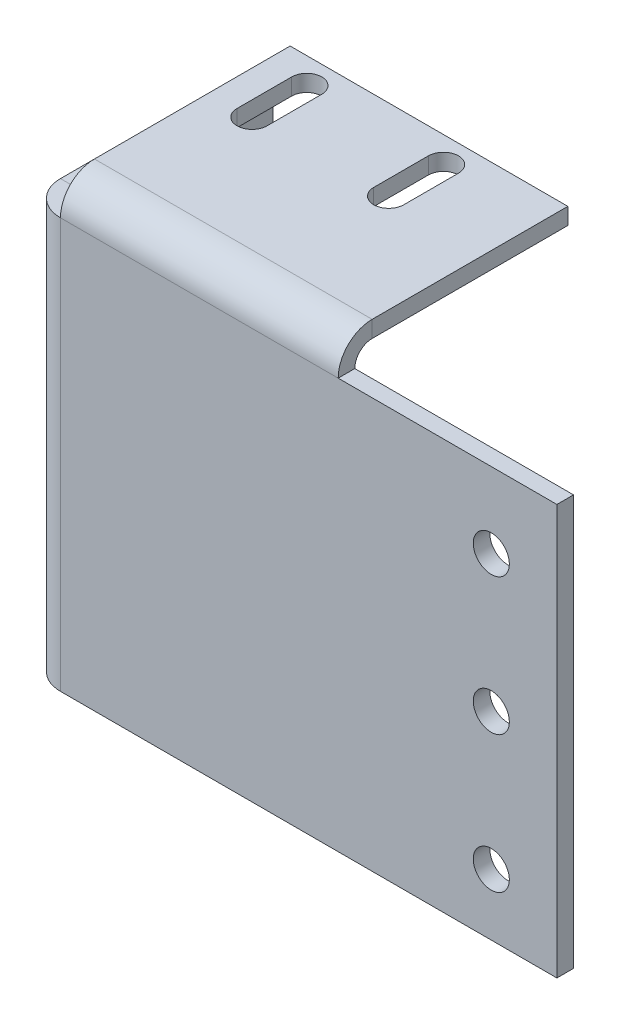
ISO-10303-21;
HEADER;
FILE_DESCRIPTION(('STEP AP214'),'2;1');
FILE_NAME('part.step','',(''),(''),'','','');
FILE_SCHEMA(('AUTOMOTIVE_DESIGN { 1 0 10303 214 1 1 1 1 }'));
ENDSEC;
DATA;
#1=APPLICATION_CONTEXT('core data for automotive mechanical design processes');
#2=APPLICATION_PROTOCOL_DEFINITION('international standard','automotive_design',2000,#1);
#3=PRODUCT_CONTEXT('',#1,'mechanical');
#4=PRODUCT('Part','Part','',(#3));
#5=PRODUCT_RELATED_PRODUCT_CATEGORY('part','',(#4));
#6=PRODUCT_DEFINITION_FORMATION('','',#4);
#7=PRODUCT_DEFINITION_CONTEXT('part definition',#1,'design');
#8=PRODUCT_DEFINITION('design','',#6,#7);
#9=PRODUCT_DEFINITION_SHAPE('','',#8);
#10=(LENGTH_UNIT() NAMED_UNIT(*) SI_UNIT(.MILLI.,.METRE.));
#11=(NAMED_UNIT(*) PLANE_ANGLE_UNIT() SI_UNIT($,.RADIAN.));
#12=(NAMED_UNIT(*) SI_UNIT($,.STERADIAN.) SOLID_ANGLE_UNIT());
#13=UNCERTAINTY_MEASURE_WITH_UNIT(LENGTH_MEASURE(1.E-05),#10,'distance_accuracy_value','');
#14=(GEOMETRIC_REPRESENTATION_CONTEXT(3) GLOBAL_UNCERTAINTY_ASSIGNED_CONTEXT((#13)) GLOBAL_UNIT_ASSIGNED_CONTEXT((#10,
#11,#12)) REPRESENTATION_CONTEXT('',''));
#15=CARTESIAN_POINT('',(0.,0.,0.));
#16=DIRECTION('',(0.,0.,1.));
#17=DIRECTION('',(1.,0.,0.));
#18=AXIS2_PLACEMENT_3D('',#15,#16,#17);
#19=CARTESIAN_POINT('',(0.,37.5000000000001,-3.03784000000001));
#20=DIRECTION('',(0.,1.,0.));
#21=DIRECTION('',(-1.,0.,0.));
#22=AXIS2_PLACEMENT_3D('',#19,#20,#21);
#23=PLANE('',#22);
#24=DIRECTION('',(-1.,0.,0.));
#25=VECTOR('',#24,1.);
#26=CARTESIAN_POINT('',(0.,37.5000000000001,-3.03784000000001));
#27=LINE('',#26,#25);
#28=CARTESIAN_POINT('',(0.,37.5000000000001,-3.03784000000001));
#29=VERTEX_POINT('',#28);
#30=CARTESIAN_POINT('',(-40.,37.5000000000001,-3.03784000000001));
#31=VERTEX_POINT('',#30);
#32=EDGE_CURVE('E373',#29,#31,#27,.T.);
#33=ORIENTED_EDGE('',*,*,#32,.T.);
#34=DIRECTION('',(0.,0.,1.));
#35=VECTOR('',#34,1.);
#36=CARTESIAN_POINT('',(-40.,37.5000000000001,-3.03784000000001));
#37=LINE('',#36,#35);
#38=CARTESIAN_POINT('',(-40.,37.5000000000001,0.));
#39=VERTEX_POINT('',#38);
#40=EDGE_CURVE('E306',#31,#39,#37,.T.);
#41=ORIENTED_EDGE('',*,*,#40,.T.);
#42=DIRECTION('',(-1.,0.,0.));
#43=VECTOR('',#42,1.);
#44=CARTESIAN_POINT('',(0.,37.5000000000001,0.));
#45=LINE('',#44,#43);
#46=CARTESIAN_POINT('',(0.,37.5000000000001,0.));
#47=VERTEX_POINT('',#46);
#48=EDGE_CURVE('E382',#47,#39,#45,.T.);
#49=ORIENTED_EDGE('',*,*,#48,.F.);
#50=DIRECTION('',(0.,0.,1.));
#51=VECTOR('',#50,1.);
#52=CARTESIAN_POINT('',(0.,37.5000000000001,-3.03784000000001));
#53=LINE('',#52,#51);
#54=EDGE_CURVE('E379',#29,#47,#53,.T.);
#55=ORIENTED_EDGE('',*,*,#54,.F.);
#56=EDGE_LOOP('',(#33,#41,#49,#55));
#57=FACE_BOUND('',#56,.T.);
#58=ADVANCED_FACE('F78',(#57),#23,.T.);
#59=CARTESIAN_POINT('',(0.,0.,-3.03784000000001));
#60=DIRECTION('',(0.,0.,-1.));
#61=DIRECTION('',(-1.,0.,0.));
#62=AXIS2_PLACEMENT_3D('',#59,#60,#61);
#63=PLANE('',#62);
#64=CARTESIAN_POINT('',(-12.,23.71284,-3.03784000000001));
#65=DIRECTION('',(0.,0.,-1.));
#66=DIRECTION('',(-1.,0.,0.));
#67=AXIS2_PLACEMENT_3D('',#64,#65,#66);
#68=CIRCLE('',#67,3.29999999999999);
#69=CARTESIAN_POINT('',(-15.3,23.71284,-3.03784000000001));
#70=VERTEX_POINT('',#69);
#71=EDGE_CURVE('E423',#70,#70,#68,.T.);
#72=ORIENTED_EDGE('',*,*,#71,.F.);
#73=EDGE_LOOP('',(#72));
#74=FACE_BOUND('',#73,.T.);
#75=CARTESIAN_POINT('',(-12.,-26.2871599999999,-3.03784000000001));
#76=DIRECTION('',(0.,0.,-1.));
#77=DIRECTION('',(-1.,0.,0.));
#78=AXIS2_PLACEMENT_3D('',#75,#76,#77);
#79=CIRCLE('',#78,3.29999999999999);
#80=CARTESIAN_POINT('',(-15.3,-26.2871599999999,-3.03784000000001));
#81=VERTEX_POINT('',#80);
#82=EDGE_CURVE('E417',#81,#81,#79,.T.);
#83=ORIENTED_EDGE('',*,*,#82,.F.);
#84=EDGE_LOOP('',(#83));
#85=FACE_BOUND('',#84,.T.);
#86=CARTESIAN_POINT('',(-12.,-1.28715999999995,-3.03784000000001));
#87=DIRECTION('',(0.,0.,-1.));
#88=DIRECTION('',(-1.,0.,0.));
#89=AXIS2_PLACEMENT_3D('',#86,#87,#88);
#90=CIRCLE('',#89,3.29999999999999);
#91=CARTESIAN_POINT('',(-15.3,-1.28715999999995,-3.03784000000001));
#92=VERTEX_POINT('',#91);
#93=EDGE_CURVE('E410',#92,#92,#90,.T.);
#94=ORIENTED_EDGE('',*,*,#93,.F.);
#95=EDGE_LOOP('',(#94));
#96=FACE_BOUND('',#95,.T.);
#97=DIRECTION('',(1.,0.,0.));
#98=VECTOR('',#97,1.);
#99=CARTESIAN_POINT('',(0.,-37.5000000000001,-3.03784000000001));
#100=LINE('',#99,#98);
#101=CARTESIAN_POINT('',(-90.78716,-37.5000000000001,-3.03783999999996));
#102=VERTEX_POINT('',#101);
#103=CARTESIAN_POINT('',(0.,-37.5000000000001,-3.03784000000001));
#104=VERTEX_POINT('',#103);
#105=EDGE_CURVE('E377',#102,#104,#100,.T.);
#106=ORIENTED_EDGE('',*,*,#105,.F.);
#107=DIRECTION('',(0.,1.,0.));
#108=VECTOR('',#107,1.);
#109=CARTESIAN_POINT('',(-90.7871600000001,37.5000000000001,-3.03784000000001));
#110=LINE('',#109,#108);
#111=CARTESIAN_POINT('',(-90.78716,37.5000000000001,-3.03784000000001));
#112=VERTEX_POINT('',#111);
#113=EDGE_CURVE('E360',#112,#102,#110,.F.);
#114=ORIENTED_EDGE('',*,*,#113,.F.);
#115=DIRECTION('',(1.,0.,0.));
#116=VECTOR('',#115,1.);
#117=CARTESIAN_POINT('',(-40.,37.5000000000001,-3.03784000000001));
#118=LINE('',#117,#116);
#119=EDGE_CURVE('E311',#31,#112,#118,.F.);
#120=ORIENTED_EDGE('',*,*,#119,.F.);
#121=ORIENTED_EDGE('',*,*,#32,.F.);
#122=DIRECTION('',(0.,1.,0.));
#123=VECTOR('',#122,1.);
#124=CARTESIAN_POINT('',(0.,37.5000000000001,-3.03784000000001));
#125=LINE('',#124,#123);
#126=EDGE_CURVE('E370',#104,#29,#125,.T.);
#127=ORIENTED_EDGE('',*,*,#126,.F.);
#128=EDGE_LOOP('',(#106,#114,#120,#121,#127));
#129=FACE_BOUND('',#128,.T.);
#130=ADVANCED_FACE('F435',(#74,#85,#96,#129),#63,.T.);
#131=CARTESIAN_POINT('',(0.,0.,0.));
#132=DIRECTION('',(0.,0.,-1.));
#133=DIRECTION('',(-1.,0.,0.));
#134=AXIS2_PLACEMENT_3D('',#131,#132,#133);
#135=PLANE('',#134);
#136=CARTESIAN_POINT('',(-12.,23.71284,0.));
#137=DIRECTION('',(0.,0.,1.));
#138=DIRECTION('',(1.,0.,0.));
#139=AXIS2_PLACEMENT_3D('',#136,#137,#138);
#140=CIRCLE('',#139,3.29999999999999);
#141=CARTESIAN_POINT('',(-8.70000000000005,23.71284,0.));
#142=VERTEX_POINT('',#141);
#143=EDGE_CURVE('E426',#142,#142,#140,.T.);
#144=ORIENTED_EDGE('',*,*,#143,.F.);
#145=EDGE_LOOP('',(#144));
#146=FACE_BOUND('',#145,.T.);
#147=CARTESIAN_POINT('',(-12.,-26.2871599999999,0.));
#148=DIRECTION('',(0.,0.,1.));
#149=DIRECTION('',(1.,0.,0.));
#150=AXIS2_PLACEMENT_3D('',#147,#148,#149);
#151=CIRCLE('',#150,3.29999999999999);
#152=CARTESIAN_POINT('',(-8.70000000000005,-26.2871599999999,0.));
#153=VERTEX_POINT('',#152);
#154=EDGE_CURVE('E420',#153,#153,#151,.T.);
#155=ORIENTED_EDGE('',*,*,#154,.F.);
#156=EDGE_LOOP('',(#155));
#157=FACE_BOUND('',#156,.T.);
#158=CARTESIAN_POINT('',(-12.,-1.28715999999995,0.));
#159=DIRECTION('',(0.,0.,1.));
#160=DIRECTION('',(1.,0.,0.));
#161=AXIS2_PLACEMENT_3D('',#158,#159,#160);
#162=CIRCLE('',#161,3.29999999999999);
#163=CARTESIAN_POINT('',(-8.70000000000005,-1.28715999999995,0.));
#164=VERTEX_POINT('',#163);
#165=EDGE_CURVE('E412',#164,#164,#162,.T.);
#166=ORIENTED_EDGE('',*,*,#165,.F.);
#167=EDGE_LOOP('',(#166));
#168=FACE_BOUND('',#167,.T.);
#169=DIRECTION('',(0.,1.,0.));
#170=VECTOR('',#169,1.);
#171=CARTESIAN_POINT('',(-90.7871600000001,37.5000000000001,0.));
#172=LINE('',#171,#170);
#173=CARTESIAN_POINT('',(-90.78716,37.5000000000001,0.));
#174=VERTEX_POINT('',#173);
#175=CARTESIAN_POINT('',(-90.78716,-37.5000000000001,0.));
#176=VERTEX_POINT('',#175);
#177=EDGE_CURVE('E348',#174,#176,#172,.F.);
#178=ORIENTED_EDGE('',*,*,#177,.T.);
#179=DIRECTION('',(1.,0.,0.));
#180=VECTOR('',#179,1.);
#181=CARTESIAN_POINT('',(0.,-37.5000000000001,0.));
#182=LINE('',#181,#180);
#183=CARTESIAN_POINT('',(0.,-37.5000000000001,0.));
#184=VERTEX_POINT('',#183);
#185=EDGE_CURVE('E374',#176,#184,#182,.T.);
#186=ORIENTED_EDGE('',*,*,#185,.T.);
#187=DIRECTION('',(0.,1.,0.));
#188=VECTOR('',#187,1.);
#189=CARTESIAN_POINT('',(0.,37.5000000000001,0.));
#190=LINE('',#189,#188);
#191=EDGE_CURVE('E368',#184,#47,#190,.T.);
#192=ORIENTED_EDGE('',*,*,#191,.T.);
#193=ORIENTED_EDGE('',*,*,#48,.T.);
#194=DIRECTION('',(1.,0.,0.));
#195=VECTOR('',#194,1.);
#196=CARTESIAN_POINT('',(-40.,37.5000000000001,0.));
#197=LINE('',#196,#195);
#198=EDGE_CURVE('E299',#39,#174,#197,.F.);
#199=ORIENTED_EDGE('',*,*,#198,.T.);
#200=EDGE_LOOP('',(#178,#186,#192,#193,#199));
#201=FACE_BOUND('',#200,.T.);
#202=ADVANCED_FACE('F432',(#146,#157,#168,#201),#135,.F.);
#203=CARTESIAN_POINT('',(0.,37.5000000000001,-3.03784000000001));
#204=DIRECTION('',(1.,0.,0.));
#205=DIRECTION('',(0.,0.,-1.));
#206=AXIS2_PLACEMENT_3D('',#203,#204,#205);
#207=PLANE('',#206);
#208=ORIENTED_EDGE('',*,*,#191,.F.);
#209=DIRECTION('',(0.,0.,1.));
#210=VECTOR('',#209,1.);
#211=CARTESIAN_POINT('',(0.,-37.5000000000001,-3.03784000000001));
#212=LINE('',#211,#210);
#213=EDGE_CURVE('E386',#104,#184,#212,.T.);
#214=ORIENTED_EDGE('',*,*,#213,.F.);
#215=ORIENTED_EDGE('',*,*,#126,.T.);
#216=ORIENTED_EDGE('',*,*,#54,.T.);
#217=EDGE_LOOP('',(#208,#214,#215,#216));
#218=FACE_BOUND('',#217,.T.);
#219=ADVANCED_FACE('F80',(#218),#207,.T.);
#220=CARTESIAN_POINT('',(0.,-37.5000000000001,-3.03784000000001));
#221=DIRECTION('',(0.,-1.,0.));
#222=DIRECTION('',(1.,0.,0.));
#223=AXIS2_PLACEMENT_3D('',#220,#221,#222);
#224=PLANE('',#223);
#225=DIRECTION('',(0.,0.,1.));
#226=VECTOR('',#225,1.);
#227=CARTESIAN_POINT('',(-90.7871600000001,-37.5000000000001,-3.03783999999996));
#228=LINE('',#227,#226);
#229=EDGE_CURVE('E365',#102,#176,#228,.T.);
#230=ORIENTED_EDGE('',*,*,#229,.F.);
#231=ORIENTED_EDGE('',*,*,#105,.T.);
#232=ORIENTED_EDGE('',*,*,#213,.T.);
#233=ORIENTED_EDGE('',*,*,#185,.F.);
#234=EDGE_LOOP('',(#230,#231,#232,#233));
#235=FACE_BOUND('',#234,.T.);
#236=ADVANCED_FACE('F447',(#235),#224,.T.);
#237=CARTESIAN_POINT('',(-90.7871600000001,-37.5000000000001,-6.21284));
#238=DIRECTION('',(0.,-1.,0.));
#239=DIRECTION('',(0.,0.,-1.));
#240=AXIS2_PLACEMENT_3D('',#237,#238,#239);
#241=PLANE('',#240);
#242=DIRECTION('',(1.,0.,0.));
#243=VECTOR('',#242,1.);
#244=CARTESIAN_POINT('',(-97.0000000000001,-37.5000000000001,-6.21283999999994));
#245=LINE('',#244,#243);
#246=CARTESIAN_POINT('',(-93.9621600000001,-37.5000000000001,-6.21283999999994));
#247=VERTEX_POINT('',#246);
#248=CARTESIAN_POINT('',(-97.0000000000001,-37.5000000000001,-6.21283999999994));
#249=VERTEX_POINT('',#248);
#250=EDGE_CURVE('E317',#247,#249,#245,.F.);
#251=ORIENTED_EDGE('',*,*,#250,.F.);
#252=CARTESIAN_POINT('',(-90.7871600000001,-37.5000000000001,-6.21284));
#253=DIRECTION('',(0.,1.,0.));
#254=DIRECTION('',(0.,0.,1.));
#255=AXIS2_PLACEMENT_3D('',#252,#253,#254);
#256=CIRCLE('',#255,3.175);
#257=EDGE_CURVE('E357',#102,#247,#256,.F.);
#258=ORIENTED_EDGE('',*,*,#257,.F.);
#259=ORIENTED_EDGE('',*,*,#229,.T.);
#260=CARTESIAN_POINT('',(-90.7871600000001,-37.5000000000001,-6.21284));
#261=DIRECTION('',(0.,1.,0.));
#262=DIRECTION('',(0.,0.,1.));
#263=AXIS2_PLACEMENT_3D('',#260,#261,#262);
#264=CIRCLE('',#263,6.21284);
#265=EDGE_CURVE('E350',#176,#249,#264,.F.);
#266=ORIENTED_EDGE('',*,*,#265,.T.);
#267=EDGE_LOOP('',(#251,#258,#259,#266));
#268=FACE_BOUND('',#267,.T.);
#269=ADVANCED_FACE('F453',(#268),#241,.T.);
#270=CARTESIAN_POINT('',(-90.7871600000001,37.5000000000001,-6.21284));
#271=DIRECTION('',(0.,-1.,0.));
#272=DIRECTION('',(0.,0.,-1.));
#273=AXIS2_PLACEMENT_3D('',#270,#271,#272);
#274=PLANE('',#273);
#275=CARTESIAN_POINT('',(-90.7871600000001,37.5000000000001,-6.21284));
#276=DIRECTION('',(0.,1.,0.));
#277=DIRECTION('',(0.,0.,1.));
#278=AXIS2_PLACEMENT_3D('',#275,#276,#277);
#279=CIRCLE('',#278,3.175);
#280=CARTESIAN_POINT('',(-93.9621600000001,37.5000000000001,-6.21284));
#281=VERTEX_POINT('',#280);
#282=EDGE_CURVE('E321',#281,#112,#279,.T.);
#283=ORIENTED_EDGE('',*,*,#282,.F.);
#284=DIRECTION('',(1.,0.,0.));
#285=VECTOR('',#284,1.);
#286=CARTESIAN_POINT('',(-93.9621600000001,37.5000000000001,-6.21284));
#287=LINE('',#286,#285);
#288=CARTESIAN_POINT('',(-97.0000000000001,37.5000000000001,-6.21284));
#289=VERTEX_POINT('',#288);
#290=EDGE_CURVE('E341',#281,#289,#287,.F.);
#291=ORIENTED_EDGE('',*,*,#290,.T.);
#292=CARTESIAN_POINT('',(-90.7871600000001,37.5000000000001,-6.21284));
#293=DIRECTION('',(0.,1.,0.));
#294=DIRECTION('',(0.,0.,1.));
#295=AXIS2_PLACEMENT_3D('',#292,#293,#294);
#296=CIRCLE('',#295,6.21284);
#297=EDGE_CURVE('E351',#289,#174,#296,.T.);
#298=ORIENTED_EDGE('',*,*,#297,.T.);
#299=DIRECTION('',(0.,0.,1.));
#300=VECTOR('',#299,1.);
#301=CARTESIAN_POINT('',(-90.7871600000001,37.5000000000001,-3.03784000000001));
#302=LINE('',#301,#300);
#303=EDGE_CURVE('E354',#112,#174,#302,.T.);
#304=ORIENTED_EDGE('',*,*,#303,.F.);
#305=EDGE_LOOP('',(#283,#291,#298,#304));
#306=FACE_BOUND('',#305,.T.);
#307=ADVANCED_FACE('F500',(#306),#274,.F.);
#308=CARTESIAN_POINT('',(-90.7871600000001,37.5000000000001,-6.21284));
#309=DIRECTION('',(0.,1.,0.));
#310=DIRECTION('',(-1.,0.,0.));
#311=AXIS2_PLACEMENT_3D('',#308,#309,#310);
#312=CYLINDRICAL_SURFACE('',#311,6.21284);
#313=ORIENTED_EDGE('',*,*,#177,.F.);
#314=ORIENTED_EDGE('',*,*,#297,.F.);
#315=DIRECTION('',(0.,1.,0.));
#316=VECTOR('',#315,1.);
#317=CARTESIAN_POINT('',(-97.0000000000001,-37.5000000000001,-6.21283999999994));
#318=LINE('',#317,#316);
#319=EDGE_CURVE('E339',#289,#249,#318,.F.);
#320=ORIENTED_EDGE('',*,*,#319,.T.);
#321=ORIENTED_EDGE('',*,*,#265,.F.);
#322=EDGE_LOOP('',(#313,#314,#320,#321));
#323=FACE_BOUND('',#322,.T.);
#324=ADVANCED_FACE('F454',(#323),#312,.T.);
#325=CARTESIAN_POINT('',(-90.7871600000001,37.5000000000001,-6.21284));
#326=DIRECTION('',(0.,1.,0.));
#327=DIRECTION('',(-1.,0.,0.));
#328=AXIS2_PLACEMENT_3D('',#325,#326,#327);
#329=CYLINDRICAL_SURFACE('',#328,3.175);
#330=ORIENTED_EDGE('',*,*,#113,.T.);
#331=ORIENTED_EDGE('',*,*,#257,.T.);
#332=DIRECTION('',(0.,1.,0.));
#333=VECTOR('',#332,1.);
#334=CARTESIAN_POINT('',(-93.9621600000001,-37.5000000000001,-6.21283999999994));
#335=LINE('',#334,#333);
#336=EDGE_CURVE('E344',#247,#281,#335,.T.);
#337=ORIENTED_EDGE('',*,*,#336,.T.);
#338=ORIENTED_EDGE('',*,*,#282,.T.);
#339=EDGE_LOOP('',(#330,#331,#337,#338));
#340=FACE_BOUND('',#339,.T.);
#341=ADVANCED_FACE('F475',(#340),#329,.F.);
#342=CARTESIAN_POINT('',(-97.0000000000002,37.5000000000001,-42.));
#343=DIRECTION('',(0.,-1.,0.));
#344=DIRECTION('',(0.,0.,-1.));
#345=AXIS2_PLACEMENT_3D('',#342,#343,#344);
#346=PLANE('',#345);
#347=ORIENTED_EDGE('',*,*,#290,.F.);
#348=DIRECTION('',(0.,0.,1.));
#349=VECTOR('',#348,1.);
#350=CARTESIAN_POINT('',(-93.9621600000002,37.5000000000001,-42.));
#351=LINE('',#350,#349);
#352=CARTESIAN_POINT('',(-93.9621600000002,37.5000000000001,-42.));
#353=VERTEX_POINT('',#352);
#354=EDGE_CURVE('E337',#281,#353,#351,.F.);
#355=ORIENTED_EDGE('',*,*,#354,.T.);
#356=DIRECTION('',(1.,0.,0.));
#357=VECTOR('',#356,1.);
#358=CARTESIAN_POINT('',(-97.0000000000002,37.5000000000001,-42.));
#359=LINE('',#358,#357);
#360=CARTESIAN_POINT('',(-97.0000000000002,37.5000000000001,-42.));
#361=VERTEX_POINT('',#360);
#362=EDGE_CURVE('E318',#361,#353,#359,.T.);
#363=ORIENTED_EDGE('',*,*,#362,.F.);
#364=DIRECTION('',(0.,0.,-1.));
#365=VECTOR('',#364,1.);
#366=CARTESIAN_POINT('',(-97.,37.5000000000001,3.33066907387547E-13));
#367=LINE('',#366,#365);
#368=EDGE_CURVE('E330',#289,#361,#367,.T.);
#369=ORIENTED_EDGE('',*,*,#368,.F.);
#370=EDGE_LOOP('',(#347,#355,#363,#369));
#371=FACE_BOUND('',#370,.T.);
#372=ADVANCED_FACE('F464',(#371),#346,.F.);
#373=CARTESIAN_POINT('',(-97.0000000000001,-37.5000000000001,-3.03783999999996));
#374=DIRECTION('',(0.,1.,0.));
#375=DIRECTION('',(0.,0.,1.));
#376=AXIS2_PLACEMENT_3D('',#373,#374,#375);
#377=PLANE('',#376);
#378=ORIENTED_EDGE('',*,*,#250,.T.);
#379=DIRECTION('',(0.,0.,1.));
#380=VECTOR('',#379,1.);
#381=CARTESIAN_POINT('',(-97.,-37.5000000000001,3.88578058618805E-13));
#382=LINE('',#381,#380);
#383=CARTESIAN_POINT('',(-97.0000000000002,-37.5000000000001,-42.));
#384=VERTEX_POINT('',#383);
#385=EDGE_CURVE('E325',#384,#249,#382,.T.);
#386=ORIENTED_EDGE('',*,*,#385,.F.);
#387=DIRECTION('',(1.,0.,0.));
#388=VECTOR('',#387,1.);
#389=CARTESIAN_POINT('',(-97.0000000000002,-37.5000000000001,-42.));
#390=LINE('',#389,#388);
#391=CARTESIAN_POINT('',(-93.9621600000002,-37.5000000000001,-42.));
#392=VERTEX_POINT('',#391);
#393=EDGE_CURVE('E322',#384,#392,#390,.T.);
#394=ORIENTED_EDGE('',*,*,#393,.T.);
#395=DIRECTION('',(0.,0.,-1.));
#396=VECTOR('',#395,1.);
#397=CARTESIAN_POINT('',(-93.9621600000001,-37.5000000000001,-3.03783999999996));
#398=LINE('',#397,#396);
#399=EDGE_CURVE('E332',#392,#247,#398,.F.);
#400=ORIENTED_EDGE('',*,*,#399,.T.);
#401=EDGE_LOOP('',(#378,#386,#394,#400));
#402=FACE_BOUND('',#401,.T.);
#403=ADVANCED_FACE('F472',(#402),#377,.F.);
#404=CARTESIAN_POINT('',(-97.,0.,3.88578058618805E-13));
#405=DIRECTION('',(1.,0.,0.));
#406=DIRECTION('',(0.,0.,-1.));
#407=AXIS2_PLACEMENT_3D('',#404,#405,#406);
#408=PLANE('',#407);
#409=ORIENTED_EDGE('',*,*,#319,.F.);
#410=ORIENTED_EDGE('',*,*,#368,.T.);
#411=DIRECTION('',(0.,-1.,0.));
#412=VECTOR('',#411,1.);
#413=CARTESIAN_POINT('',(-97.0000000000002,0.,-42.));
#414=LINE('',#413,#412);
#415=EDGE_CURVE('E328',#361,#384,#414,.T.);
#416=ORIENTED_EDGE('',*,*,#415,.T.);
#417=ORIENTED_EDGE('',*,*,#385,.T.);
#418=EDGE_LOOP('',(#409,#410,#416,#417));
#419=FACE_BOUND('',#418,.T.);
#420=ADVANCED_FACE('F458',(#419),#408,.F.);
#421=CARTESIAN_POINT('',(-93.96216,0.,3.33066907387547E-13));
#422=DIRECTION('',(1.,0.,0.));
#423=DIRECTION('',(0.,0.,-1.));
#424=AXIS2_PLACEMENT_3D('',#421,#422,#423);
#425=PLANE('',#424);
#426=ORIENTED_EDGE('',*,*,#354,.F.);
#427=ORIENTED_EDGE('',*,*,#336,.F.);
#428=ORIENTED_EDGE('',*,*,#399,.F.);
#429=DIRECTION('',(0.,1.,0.));
#430=VECTOR('',#429,1.);
#431=CARTESIAN_POINT('',(-93.9621600000002,-37.5000000000001,-42.));
#432=LINE('',#431,#430);
#433=EDGE_CURVE('E335',#353,#392,#432,.F.);
#434=ORIENTED_EDGE('',*,*,#433,.F.);
#435=EDGE_LOOP('',(#426,#427,#428,#434));
#436=FACE_BOUND('',#435,.T.);
#437=ADVANCED_FACE('F479',(#436),#425,.T.);
#438=CARTESIAN_POINT('',(-97.0000000000002,-37.5000000000001,-42.));
#439=DIRECTION('',(0.,0.,1.));
#440=DIRECTION('',(1.,0.,0.));
#441=AXIS2_PLACEMENT_3D('',#438,#439,#440);
#442=PLANE('',#441);
#443=ORIENTED_EDGE('',*,*,#433,.T.);
#444=ORIENTED_EDGE('',*,*,#393,.F.);
#445=ORIENTED_EDGE('',*,*,#415,.F.);
#446=ORIENTED_EDGE('',*,*,#362,.T.);
#447=EDGE_LOOP('',(#443,#444,#445,#446));
#448=FACE_BOUND('',#447,.T.);
#449=ADVANCED_FACE('F468',(#448),#442,.F.);
#450=CARTESIAN_POINT('',(-90.78716,37.5000000000001,-6.21284));
#451=DIRECTION('',(-1.,0.,0.));
#452=DIRECTION('',(0.,0.,1.));
#453=AXIS2_PLACEMENT_3D('',#450,#451,#452);
#454=PLANE('',#453);
#455=DIRECTION('',(0.,-1.,0.));
#456=VECTOR('',#455,1.);
#457=CARTESIAN_POINT('',(-90.78716,43.71284,-6.21284));
#458=LINE('',#457,#456);
#459=CARTESIAN_POINT('',(-90.78716,40.6749999999998,-6.21284));
#460=VERTEX_POINT('',#459);
#461=CARTESIAN_POINT('',(-90.78716,43.71284,-6.21284));
#462=VERTEX_POINT('',#461);
#463=EDGE_CURVE('E262',#460,#462,#458,.F.);
#464=ORIENTED_EDGE('',*,*,#463,.F.);
#465=CARTESIAN_POINT('',(-90.78716,37.5000000000001,-6.21284));
#466=DIRECTION('',(1.,0.,0.));
#467=DIRECTION('',(0.,0.,-1.));
#468=AXIS2_PLACEMENT_3D('',#465,#466,#467);
#469=CIRCLE('',#468,3.175);
#470=EDGE_CURVE('E308',#112,#460,#469,.F.);
#471=ORIENTED_EDGE('',*,*,#470,.F.);
#472=ORIENTED_EDGE('',*,*,#303,.T.);
#473=CARTESIAN_POINT('',(-90.78716,37.5000000000001,-6.21284));
#474=DIRECTION('',(1.,0.,0.));
#475=DIRECTION('',(0.,0.,-1.));
#476=AXIS2_PLACEMENT_3D('',#473,#474,#475);
#477=CIRCLE('',#476,6.21284);
#478=EDGE_CURVE('E302',#174,#462,#477,.F.);
#479=ORIENTED_EDGE('',*,*,#478,.T.);
#480=EDGE_LOOP('',(#464,#471,#472,#479));
#481=FACE_BOUND('',#480,.T.);
#482=ADVANCED_FACE('F486',(#481),#454,.T.);
#483=CARTESIAN_POINT('',(-40.,37.5000000000001,-6.21284));
#484=DIRECTION('',(-1.,0.,0.));
#485=DIRECTION('',(0.,0.,1.));
#486=AXIS2_PLACEMENT_3D('',#483,#484,#485);
#487=PLANE('',#486);
#488=CARTESIAN_POINT('',(-40.,37.5000000000001,-6.21284));
#489=DIRECTION('',(1.,0.,0.));
#490=DIRECTION('',(0.,0.,-1.));
#491=AXIS2_PLACEMENT_3D('',#488,#489,#490);
#492=CIRCLE('',#491,3.175);
#493=CARTESIAN_POINT('',(-40.,40.6749999999998,-6.21284));
#494=VERTEX_POINT('',#493);
#495=EDGE_CURVE('E272',#494,#31,#492,.T.);
#496=ORIENTED_EDGE('',*,*,#495,.F.);
#497=DIRECTION('',(0.,-1.,0.));
#498=VECTOR('',#497,1.);
#499=CARTESIAN_POINT('',(-40.,40.6749999999998,-6.21284));
#500=LINE('',#499,#498);
#501=CARTESIAN_POINT('',(-40.,43.71284,-6.21284));
#502=VERTEX_POINT('',#501);
#503=EDGE_CURVE('E292',#494,#502,#500,.F.);
#504=ORIENTED_EDGE('',*,*,#503,.T.);
#505=CARTESIAN_POINT('',(-40.,37.5000000000001,-6.21284));
#506=DIRECTION('',(1.,0.,0.));
#507=DIRECTION('',(0.,0.,-1.));
#508=AXIS2_PLACEMENT_3D('',#505,#506,#507);
#509=CIRCLE('',#508,6.21284);
#510=EDGE_CURVE('E303',#502,#39,#509,.T.);
#511=ORIENTED_EDGE('',*,*,#510,.T.);
#512=ORIENTED_EDGE('',*,*,#40,.F.);
#513=EDGE_LOOP('',(#496,#504,#511,#512));
#514=FACE_BOUND('',#513,.T.);
#515=ADVANCED_FACE('F543',(#514),#487,.F.);
#516=CARTESIAN_POINT('',(-40.,37.5000000000001,-6.21284));
#517=DIRECTION('',(1.,0.,0.));
#518=DIRECTION('',(0.,1.,0.));
#519=AXIS2_PLACEMENT_3D('',#516,#517,#518);
#520=CYLINDRICAL_SURFACE('',#519,6.21284);
#521=ORIENTED_EDGE('',*,*,#198,.F.);
#522=ORIENTED_EDGE('',*,*,#510,.F.);
#523=DIRECTION('',(1.,0.,0.));
#524=VECTOR('',#523,1.);
#525=CARTESIAN_POINT('',(-90.78716,43.71284,-6.21284));
#526=LINE('',#525,#524);
#527=EDGE_CURVE('E290',#502,#462,#526,.F.);
#528=ORIENTED_EDGE('',*,*,#527,.T.);
#529=ORIENTED_EDGE('',*,*,#478,.F.);
#530=EDGE_LOOP('',(#521,#522,#528,#529));
#531=FACE_BOUND('',#530,.T.);
#532=ADVANCED_FACE('F554',(#531),#520,.T.);
#533=CARTESIAN_POINT('',(-40.,37.5000000000001,-6.21284));
#534=DIRECTION('',(1.,0.,0.));
#535=DIRECTION('',(0.,1.,0.));
#536=AXIS2_PLACEMENT_3D('',#533,#534,#535);
#537=CYLINDRICAL_SURFACE('',#536,3.175);
#538=ORIENTED_EDGE('',*,*,#119,.T.);
#539=ORIENTED_EDGE('',*,*,#470,.T.);
#540=DIRECTION('',(1.,0.,0.));
#541=VECTOR('',#540,1.);
#542=CARTESIAN_POINT('',(-90.78716,40.6749999999998,-6.21284));
#543=LINE('',#542,#541);
#544=EDGE_CURVE('E295',#460,#494,#543,.T.);
#545=ORIENTED_EDGE('',*,*,#544,.T.);
#546=ORIENTED_EDGE('',*,*,#495,.T.);
#547=EDGE_LOOP('',(#538,#539,#545,#546));
#548=FACE_BOUND('',#547,.T.);
#549=ADVANCED_FACE('F565',(#548),#537,.F.);
#550=CARTESIAN_POINT('',(-40.0000000000001,43.71284,-42.));
#551=DIRECTION('',(-1.,0.,0.));
#552=DIRECTION('',(0.,0.,1.));
#553=AXIS2_PLACEMENT_3D('',#550,#551,#552);
#554=PLANE('',#553);
#555=ORIENTED_EDGE('',*,*,#503,.F.);
#556=DIRECTION('',(0.,0.,1.));
#557=VECTOR('',#556,1.);
#558=CARTESIAN_POINT('',(-40.0000000000001,40.6750000000002,-42.));
#559=LINE('',#558,#557);
#560=CARTESIAN_POINT('',(-40.0000000000001,40.6750000000002,-42.));
#561=VERTEX_POINT('',#560);
#562=EDGE_CURVE('E288',#494,#561,#559,.F.);
#563=ORIENTED_EDGE('',*,*,#562,.T.);
#564=DIRECTION('',(0.,-1.,0.));
#565=VECTOR('',#564,1.);
#566=CARTESIAN_POINT('',(-40.0000000000001,43.71284,-42.));
#567=LINE('',#566,#565);
#568=CARTESIAN_POINT('',(-40.0000000000001,43.71284,-42.));
#569=VERTEX_POINT('',#568);
#570=EDGE_CURVE('E269',#569,#561,#567,.T.);
#571=ORIENTED_EDGE('',*,*,#570,.F.);
#572=DIRECTION('',(0.,0.,-1.));
#573=VECTOR('',#572,1.);
#574=CARTESIAN_POINT('',(-40.,43.71284,1.66533453693773E-13));
#575=LINE('',#574,#573);
#576=EDGE_CURVE('E281',#502,#569,#575,.T.);
#577=ORIENTED_EDGE('',*,*,#576,.F.);
#578=EDGE_LOOP('',(#555,#563,#571,#577));
#579=FACE_BOUND('',#578,.T.);
#580=ADVANCED_FACE('F576',(#579),#554,.F.);
#581=CARTESIAN_POINT('',(-90.78716,43.71284,-3.03784000000001));
#582=DIRECTION('',(1.,0.,0.));
#583=DIRECTION('',(0.,1.,0.));
#584=AXIS2_PLACEMENT_3D('',#581,#582,#583);
#585=PLANE('',#584);
#586=ORIENTED_EDGE('',*,*,#463,.T.);
#587=DIRECTION('',(0.,0.,1.));
#588=VECTOR('',#587,1.);
#589=CARTESIAN_POINT('',(-90.78716,43.71284,1.11022302462516E-13));
#590=LINE('',#589,#588);
#591=CARTESIAN_POINT('',(-90.78716,43.71284,-42.));
#592=VERTEX_POINT('',#591);
#593=EDGE_CURVE('E276',#592,#462,#590,.T.);
#594=ORIENTED_EDGE('',*,*,#593,.F.);
#595=DIRECTION('',(0.,-1.,0.));
#596=VECTOR('',#595,1.);
#597=CARTESIAN_POINT('',(-90.78716,43.71284,-42.));
#598=LINE('',#597,#596);
#599=CARTESIAN_POINT('',(-90.78716,40.6750000000002,-42.));
#600=VERTEX_POINT('',#599);
#601=EDGE_CURVE('E273',#592,#600,#598,.T.);
#602=ORIENTED_EDGE('',*,*,#601,.T.);
#603=DIRECTION('',(0.,0.,-1.));
#604=VECTOR('',#603,1.);
#605=CARTESIAN_POINT('',(-90.78716,40.6749999999998,-3.03784000000001));
#606=LINE('',#605,#604);
#607=EDGE_CURVE('E283',#600,#460,#606,.F.);
#608=ORIENTED_EDGE('',*,*,#607,.T.);
#609=EDGE_LOOP('',(#586,#594,#602,#608));
#610=FACE_BOUND('',#609,.T.);
#611=ADVANCED_FACE('F587',(#610),#585,.F.);
#612=CARTESIAN_POINT('',(0.,43.71284,1.11022302462516E-13));
#613=DIRECTION('',(0.,-1.,0.));
#614=DIRECTION('',(0.,0.,-1.));
#615=AXIS2_PLACEMENT_3D('',#612,#613,#614);
#616=PLANE('',#615);
#617=DIRECTION('',(0.,0.,1.));
#618=VECTOR('',#617,1.);
#619=CARTESIAN_POINT('',(-60.7499999999997,43.71284,-37.25));
#620=LINE('',#619,#618);
#621=CARTESIAN_POINT('',(-60.7499999999997,43.71284,-37.2500000000003));
#622=VERTEX_POINT('',#621);
#623=CARTESIAN_POINT('',(-60.7499999999997,43.71284,-27.25));
#624=VERTEX_POINT('',#623);
#625=EDGE_CURVE('E232',#622,#624,#620,.T.);
#626=ORIENTED_EDGE('',*,*,#625,.F.);
#627=CARTESIAN_POINT('',(-57.9999999999997,43.71284,-37.25));
#628=DIRECTION('',(0.,1.,0.));
#629=DIRECTION('',(0.,0.,1.));
#630=AXIS2_PLACEMENT_3D('',#627,#628,#629);
#631=CIRCLE('',#630,2.75);
#632=CARTESIAN_POINT('',(-55.2499999999997,43.71284,-37.25));
#633=VERTEX_POINT('',#632);
#634=EDGE_CURVE('E93',#633,#622,#631,.T.);
#635=ORIENTED_EDGE('',*,*,#634,.F.);
#636=DIRECTION('',(0.,0.,-1.));
#637=VECTOR('',#636,1.);
#638=CARTESIAN_POINT('',(-55.2499999999997,43.71284,-37.25));
#639=LINE('',#638,#637);
#640=CARTESIAN_POINT('',(-55.2499999999997,43.71284,-27.25));
#641=VERTEX_POINT('',#640);
#642=EDGE_CURVE('E239',#641,#633,#639,.T.);
#643=ORIENTED_EDGE('',*,*,#642,.F.);
#644=CARTESIAN_POINT('',(-57.9999999999997,43.71284,-27.25));
#645=DIRECTION('',(0.,1.,0.));
#646=DIRECTION('',(0.,0.,1.));
#647=AXIS2_PLACEMENT_3D('',#644,#645,#646);
#648=CIRCLE('',#647,2.75);
#649=EDGE_CURVE('E223',#624,#641,#648,.T.);
#650=ORIENTED_EDGE('',*,*,#649,.F.);
#651=EDGE_LOOP('',(#626,#635,#643,#650));
#652=FACE_BOUND('',#651,.T.);
#653=DIRECTION('',(0.,0.,1.));
#654=VECTOR('',#653,1.);
#655=CARTESIAN_POINT('',(-85.7499999999998,43.71284,-37.25));
#656=LINE('',#655,#654);
#657=CARTESIAN_POINT('',(-85.7499999999998,43.71284,-37.2500000000003));
#658=VERTEX_POINT('',#657);
#659=CARTESIAN_POINT('',(-85.7499999999998,43.71284,-27.25));
#660=VERTEX_POINT('',#659);
#661=EDGE_CURVE('E250',#658,#660,#656,.T.);
#662=ORIENTED_EDGE('',*,*,#661,.F.);
#663=CARTESIAN_POINT('',(-82.9999999999997,43.71284,-37.25));
#664=DIRECTION('',(0.,1.,0.));
#665=DIRECTION('',(0.,0.,1.));
#666=AXIS2_PLACEMENT_3D('',#663,#664,#665);
#667=CIRCLE('',#666,2.75000000000002);
#668=CARTESIAN_POINT('',(-80.2499999999997,43.71284,-37.25));
#669=VERTEX_POINT('',#668);
#670=EDGE_CURVE('E246',#669,#658,#667,.T.);
#671=ORIENTED_EDGE('',*,*,#670,.F.);
#672=DIRECTION('',(0.,0.,-1.));
#673=VECTOR('',#672,1.);
#674=CARTESIAN_POINT('',(-80.2499999999997,43.71284,-37.25));
#675=LINE('',#674,#673);
#676=CARTESIAN_POINT('',(-80.2499999999997,43.71284,-27.25));
#677=VERTEX_POINT('',#676);
#678=EDGE_CURVE('E256',#677,#669,#675,.T.);
#679=ORIENTED_EDGE('',*,*,#678,.F.);
#680=CARTESIAN_POINT('',(-82.9999999999997,43.71284,-27.25));
#681=DIRECTION('',(0.,1.,0.));
#682=DIRECTION('',(0.,0.,1.));
#683=AXIS2_PLACEMENT_3D('',#680,#681,#682);
#684=CIRCLE('',#683,2.75000000000002);
#685=EDGE_CURVE('E253',#660,#677,#684,.T.);
#686=ORIENTED_EDGE('',*,*,#685,.F.);
#687=EDGE_LOOP('',(#662,#671,#679,#686));
#688=FACE_BOUND('',#687,.T.);
#689=ORIENTED_EDGE('',*,*,#527,.F.);
#690=ORIENTED_EDGE('',*,*,#576,.T.);
#691=DIRECTION('',(-1.,0.,0.));
#692=VECTOR('',#691,1.);
#693=CARTESIAN_POINT('',(0.,43.71284,-42.));
#694=LINE('',#693,#692);
#695=EDGE_CURVE('E279',#569,#592,#694,.T.);
#696=ORIENTED_EDGE('',*,*,#695,.T.);
#697=ORIENTED_EDGE('',*,*,#593,.T.);
#698=EDGE_LOOP('',(#689,#690,#696,#697));
#699=FACE_BOUND('',#698,.T.);
#700=ADVANCED_FACE('F236',(#652,#688,#699),#616,.F.);
#701=CARTESIAN_POINT('',(0.,40.6749999999998,1.11022302462516E-13));
#702=DIRECTION('',(0.,-1.,0.));
#703=DIRECTION('',(0.,0.,-1.));
#704=AXIS2_PLACEMENT_3D('',#701,#702,#703);
#705=PLANE('',#704);
#706=CARTESIAN_POINT('',(-57.9999999999997,40.6750000000002,-37.25));
#707=DIRECTION('',(0.,-1.,0.));
#708=DIRECTION('',(0.,0.,-1.));
#709=AXIS2_PLACEMENT_3D('',#706,#707,#708);
#710=CIRCLE('',#709,2.75);
#711=CARTESIAN_POINT('',(-60.7499999999997,40.6750000000002,-37.2500000000001));
#712=VERTEX_POINT('',#711);
#713=CARTESIAN_POINT('',(-55.2499999999997,40.6750000000002,-37.25));
#714=VERTEX_POINT('',#713);
#715=EDGE_CURVE('E13',#712,#714,#710,.T.);
#716=ORIENTED_EDGE('',*,*,#715,.F.);
#717=DIRECTION('',(0.,0.,-1.));
#718=VECTOR('',#717,1.);
#719=CARTESIAN_POINT('',(-60.7499999999997,40.6749999999998,1.11022302462516E-13));
#720=LINE('',#719,#718);
#721=CARTESIAN_POINT('',(-60.7499999999997,40.6750000000002,-27.25));
#722=VERTEX_POINT('',#721);
#723=EDGE_CURVE('E399',#722,#712,#720,.T.);
#724=ORIENTED_EDGE('',*,*,#723,.F.);
#725=CARTESIAN_POINT('',(-57.9999999999997,40.6750000000002,-27.25));
#726=DIRECTION('',(0.,-1.,0.));
#727=DIRECTION('',(0.,0.,-1.));
#728=AXIS2_PLACEMENT_3D('',#725,#726,#727);
#729=CIRCLE('',#728,2.75);
#730=CARTESIAN_POINT('',(-55.2499999999997,40.6750000000002,-27.25));
#731=VERTEX_POINT('',#730);
#732=EDGE_CURVE('E226',#731,#722,#729,.T.);
#733=ORIENTED_EDGE('',*,*,#732,.F.);
#734=DIRECTION('',(0.,0.,1.));
#735=VECTOR('',#734,1.);
#736=CARTESIAN_POINT('',(-55.2499999999997,40.6749999999998,1.11022302462516E-13));
#737=LINE('',#736,#735);
#738=EDGE_CURVE('E86',#714,#731,#737,.T.);
#739=ORIENTED_EDGE('',*,*,#738,.F.);
#740=EDGE_LOOP('',(#716,#724,#733,#739));
#741=FACE_BOUND('',#740,.T.);
#742=CARTESIAN_POINT('',(-82.9999999999997,40.6750000000002,-37.25));
#743=DIRECTION('',(0.,-1.,0.));
#744=DIRECTION('',(0.,0.,-1.));
#745=AXIS2_PLACEMENT_3D('',#742,#743,#744);
#746=CIRCLE('',#745,2.75000000000002);
#747=CARTESIAN_POINT('',(-85.7499999999998,40.6750000000002,-37.25));
#748=VERTEX_POINT('',#747);
#749=CARTESIAN_POINT('',(-80.2499999999997,40.6750000000002,-37.25));
#750=VERTEX_POINT('',#749);
#751=EDGE_CURVE('E397',#748,#750,#746,.T.);
#752=ORIENTED_EDGE('',*,*,#751,.F.);
#753=DIRECTION('',(0.,0.,-1.));
#754=VECTOR('',#753,1.);
#755=CARTESIAN_POINT('',(-85.7499999999998,40.6749999999998,1.11022302462516E-13));
#756=LINE('',#755,#754);
#757=CARTESIAN_POINT('',(-85.7499999999998,40.6750000000002,-27.25));
#758=VERTEX_POINT('',#757);
#759=EDGE_CURVE('E389',#758,#748,#756,.T.);
#760=ORIENTED_EDGE('',*,*,#759,.F.);
#761=CARTESIAN_POINT('',(-82.9999999999997,40.6750000000002,-27.25));
#762=DIRECTION('',(0.,-1.,0.));
#763=DIRECTION('',(0.,0.,-1.));
#764=AXIS2_PLACEMENT_3D('',#761,#762,#763);
#765=CIRCLE('',#764,2.75000000000002);
#766=CARTESIAN_POINT('',(-80.2499999999997,40.6750000000002,-27.25));
#767=VERTEX_POINT('',#766);
#768=EDGE_CURVE('E392',#767,#758,#765,.T.);
#769=ORIENTED_EDGE('',*,*,#768,.F.);
#770=DIRECTION('',(0.,0.,1.));
#771=VECTOR('',#770,1.);
#772=CARTESIAN_POINT('',(-80.2499999999997,40.6749999999998,1.11022302462516E-13));
#773=LINE('',#772,#771);
#774=EDGE_CURVE('E395',#750,#767,#773,.T.);
#775=ORIENTED_EDGE('',*,*,#774,.F.);
#776=EDGE_LOOP('',(#752,#760,#769,#775));
#777=FACE_BOUND('',#776,.T.);
#778=ORIENTED_EDGE('',*,*,#562,.F.);
#779=ORIENTED_EDGE('',*,*,#544,.F.);
#780=ORIENTED_EDGE('',*,*,#607,.F.);
#781=DIRECTION('',(1.,0.,0.));
#782=VECTOR('',#781,1.);
#783=CARTESIAN_POINT('',(-90.78716,40.6750000000002,-42.));
#784=LINE('',#783,#782);
#785=EDGE_CURVE('E286',#561,#600,#784,.F.);
#786=ORIENTED_EDGE('',*,*,#785,.F.);
#787=EDGE_LOOP('',(#778,#779,#780,#786));
#788=FACE_BOUND('',#787,.T.);
#789=ADVANCED_FACE('F407',(#741,#777,#788),#705,.T.);
#790=CARTESIAN_POINT('',(-90.78716,43.71284,-42.));
#791=DIRECTION('',(0.,0.,1.));
#792=DIRECTION('',(0.,-1.,0.));
#793=AXIS2_PLACEMENT_3D('',#790,#791,#792);
#794=PLANE('',#793);
#795=ORIENTED_EDGE('',*,*,#785,.T.);
#796=ORIENTED_EDGE('',*,*,#601,.F.);
#797=ORIENTED_EDGE('',*,*,#695,.F.);
#798=ORIENTED_EDGE('',*,*,#570,.T.);
#799=EDGE_LOOP('',(#795,#796,#797,#798));
#800=FACE_BOUND('',#799,.T.);
#801=ADVANCED_FACE('F617',(#800),#794,.F.);
#802=CARTESIAN_POINT('',(-82.9999999999997,-37.5000000000001,-37.2500000000002));
#803=DIRECTION('',(0.,1.,0.));
#804=DIRECTION('',(0.,0.,1.));
#805=AXIS2_PLACEMENT_3D('',#802,#803,#804);
#806=CYLINDRICAL_SURFACE('',#805,2.75000000000002);
#807=ORIENTED_EDGE('',*,*,#751,.T.);
#808=DIRECTION('',(0.,1.,0.));
#809=VECTOR('',#808,1.);
#810=CARTESIAN_POINT('',(-80.2499999999997,-37.5000000000001,-37.2500000000002));
#811=LINE('',#810,#809);
#812=EDGE_CURVE('E260',#750,#669,#811,.T.);
#813=ORIENTED_EDGE('',*,*,#812,.T.);
#814=ORIENTED_EDGE('',*,*,#670,.T.);
#815=DIRECTION('',(0.,1.,0.));
#816=VECTOR('',#815,1.);
#817=CARTESIAN_POINT('',(-85.7499999999997,-37.5000000000001,-37.2500000000002));
#818=LINE('',#817,#816);
#819=EDGE_CURVE('E259',#748,#658,#818,.T.);
#820=ORIENTED_EDGE('',*,*,#819,.F.);
#821=EDGE_LOOP('',(#807,#813,#814,#820));
#822=FACE_BOUND('',#821,.T.);
#823=ADVANCED_FACE('F627',(#822),#806,.F.);
#824=CARTESIAN_POINT('',(-80.2499999999997,-37.5000000000001,-37.2500000000002));
#825=DIRECTION('',(1.,0.,0.));
#826=DIRECTION('',(0.,1.,0.));
#827=AXIS2_PLACEMENT_3D('',#824,#825,#826);
#828=PLANE('',#827);
#829=ORIENTED_EDGE('',*,*,#774,.T.);
#830=DIRECTION('',(0.,1.,0.));
#831=VECTOR('',#830,1.);
#832=CARTESIAN_POINT('',(-80.2499999999997,-37.5000000000001,-27.2500000000003));
#833=LINE('',#832,#831);
#834=EDGE_CURVE('E263',#767,#677,#833,.T.);
#835=ORIENTED_EDGE('',*,*,#834,.T.);
#836=ORIENTED_EDGE('',*,*,#678,.T.);
#837=ORIENTED_EDGE('',*,*,#812,.F.);
#838=EDGE_LOOP('',(#829,#835,#836,#837));
#839=FACE_BOUND('',#838,.T.);
#840=ADVANCED_FACE('F638',(#839),#828,.F.);
#841=CARTESIAN_POINT('',(-82.9999999999997,-37.5000000000001,-27.2500000000003));
#842=DIRECTION('',(0.,1.,0.));
#843=DIRECTION('',(0.,0.,1.));
#844=AXIS2_PLACEMENT_3D('',#841,#842,#843);
#845=CYLINDRICAL_SURFACE('',#844,2.75000000000002);
#846=ORIENTED_EDGE('',*,*,#768,.T.);
#847=DIRECTION('',(0.,1.,0.));
#848=VECTOR('',#847,1.);
#849=CARTESIAN_POINT('',(-85.7499999999997,-37.5000000000001,-27.2500000000003));
#850=LINE('',#849,#848);
#851=EDGE_CURVE('E265',#758,#660,#850,.T.);
#852=ORIENTED_EDGE('',*,*,#851,.T.);
#853=ORIENTED_EDGE('',*,*,#685,.T.);
#854=ORIENTED_EDGE('',*,*,#834,.F.);
#855=EDGE_LOOP('',(#846,#852,#853,#854));
#856=FACE_BOUND('',#855,.T.);
#857=ADVANCED_FACE('F648',(#856),#845,.F.);
#858=CARTESIAN_POINT('',(-85.7499999999997,-37.5000000000001,-37.2500000000002));
#859=DIRECTION('',(-1.,0.,0.));
#860=DIRECTION('',(0.,-1.,0.));
#861=AXIS2_PLACEMENT_3D('',#858,#859,#860);
#862=PLANE('',#861);
#863=ORIENTED_EDGE('',*,*,#759,.T.);
#864=ORIENTED_EDGE('',*,*,#819,.T.);
#865=ORIENTED_EDGE('',*,*,#661,.T.);
#866=ORIENTED_EDGE('',*,*,#851,.F.);
#867=EDGE_LOOP('',(#863,#864,#865,#866));
#868=FACE_BOUND('',#867,.T.);
#869=ADVANCED_FACE('F658',(#868),#862,.F.);
#870=CARTESIAN_POINT('',(-57.9999999999997,-37.5000000000001,-37.2500000000002));
#871=DIRECTION('',(0.,1.,0.));
#872=DIRECTION('',(0.,0.,1.));
#873=AXIS2_PLACEMENT_3D('',#870,#871,#872);
#874=CYLINDRICAL_SURFACE('',#873,2.75);
#875=ORIENTED_EDGE('',*,*,#715,.T.);
#876=DIRECTION('',(0.,1.,0.));
#877=VECTOR('',#876,1.);
#878=CARTESIAN_POINT('',(-55.2499999999997,-37.5000000000001,-37.2500000000002));
#879=LINE('',#878,#877);
#880=EDGE_CURVE('E244',#714,#633,#879,.T.);
#881=ORIENTED_EDGE('',*,*,#880,.T.);
#882=ORIENTED_EDGE('',*,*,#634,.T.);
#883=DIRECTION('',(0.,1.,0.));
#884=VECTOR('',#883,1.);
#885=CARTESIAN_POINT('',(-60.7499999999997,-37.5000000000001,-37.2500000000003));
#886=LINE('',#885,#884);
#887=EDGE_CURVE('E229',#712,#622,#886,.T.);
#888=ORIENTED_EDGE('',*,*,#887,.F.);
#889=EDGE_LOOP('',(#875,#881,#882,#888));
#890=FACE_BOUND('',#889,.T.);
#891=ADVANCED_FACE('F409',(#890),#874,.F.);
#892=CARTESIAN_POINT('',(-55.2499999999997,-37.5000000000001,-37.2500000000002));
#893=DIRECTION('',(1.,0.,0.));
#894=DIRECTION('',(0.,1.,0.));
#895=AXIS2_PLACEMENT_3D('',#892,#893,#894);
#896=PLANE('',#895);
#897=ORIENTED_EDGE('',*,*,#738,.T.);
#898=DIRECTION('',(0.,1.,0.));
#899=VECTOR('',#898,1.);
#900=CARTESIAN_POINT('',(-55.2499999999997,-37.5000000000001,-27.2500000000003));
#901=LINE('',#900,#899);
#902=EDGE_CURVE('E228',#731,#641,#901,.T.);
#903=ORIENTED_EDGE('',*,*,#902,.T.);
#904=ORIENTED_EDGE('',*,*,#642,.T.);
#905=ORIENTED_EDGE('',*,*,#880,.F.);
#906=EDGE_LOOP('',(#897,#903,#904,#905));
#907=FACE_BOUND('',#906,.T.);
#908=ADVANCED_FACE('F404',(#907),#896,.F.);
#909=CARTESIAN_POINT('',(-57.9999999999997,-37.5000000000001,-27.2500000000003));
#910=DIRECTION('',(0.,1.,0.));
#911=DIRECTION('',(0.,0.,1.));
#912=AXIS2_PLACEMENT_3D('',#909,#910,#911);
#913=CYLINDRICAL_SURFACE('',#912,2.75);
#914=ORIENTED_EDGE('',*,*,#732,.T.);
#915=DIRECTION('',(0.,1.,0.));
#916=VECTOR('',#915,1.);
#917=CARTESIAN_POINT('',(-60.7499999999997,-37.5000000000001,-27.2500000000003));
#918=LINE('',#917,#916);
#919=EDGE_CURVE('E101',#722,#624,#918,.T.);
#920=ORIENTED_EDGE('',*,*,#919,.T.);
#921=ORIENTED_EDGE('',*,*,#649,.T.);
#922=ORIENTED_EDGE('',*,*,#902,.F.);
#923=EDGE_LOOP('',(#914,#920,#921,#922));
#924=FACE_BOUND('',#923,.T.);
#925=ADVANCED_FACE('F220',(#924),#913,.F.);
#926=CARTESIAN_POINT('',(-60.7499999999997,-37.5000000000001,-37.2500000000003));
#927=DIRECTION('',(-1.,0.,0.));
#928=DIRECTION('',(0.,-1.,0.));
#929=AXIS2_PLACEMENT_3D('',#926,#927,#928);
#930=PLANE('',#929);
#931=ORIENTED_EDGE('',*,*,#723,.T.);
#932=ORIENTED_EDGE('',*,*,#887,.T.);
#933=ORIENTED_EDGE('',*,*,#625,.T.);
#934=ORIENTED_EDGE('',*,*,#919,.F.);
#935=EDGE_LOOP('',(#931,#932,#933,#934));
#936=FACE_BOUND('',#935,.T.);
#937=ADVANCED_FACE('F233',(#936),#930,.F.);
#938=CARTESIAN_POINT('',(-12.,-1.28715999999995,0.));
#939=DIRECTION('',(0.,0.,1.));
#940=DIRECTION('',(1.,0.,0.));
#941=AXIS2_PLACEMENT_3D('',#938,#939,#940);
#942=CYLINDRICAL_SURFACE('',#941,3.29999999999999);
#943=ORIENTED_EDGE('',*,*,#93,.T.);
#944=EDGE_LOOP('',(#943));
#945=FACE_BOUND('',#944,.T.);
#946=ORIENTED_EDGE('',*,*,#165,.T.);
#947=EDGE_LOOP('',(#946));
#948=FACE_BOUND('',#947,.T.);
#949=ADVANCED_FACE('F701',(#945,#948),#942,.F.);
#950=CARTESIAN_POINT('',(-12.,-26.2871599999999,0.));
#951=DIRECTION('',(0.,0.,1.));
#952=DIRECTION('',(1.,0.,0.));
#953=AXIS2_PLACEMENT_3D('',#950,#951,#952);
#954=CYLINDRICAL_SURFACE('',#953,3.29999999999999);
#955=ORIENTED_EDGE('',*,*,#82,.T.);
#956=EDGE_LOOP('',(#955));
#957=FACE_BOUND('',#956,.T.);
#958=ORIENTED_EDGE('',*,*,#154,.T.);
#959=EDGE_LOOP('',(#958));
#960=FACE_BOUND('',#959,.T.);
#961=ADVANCED_FACE('F710',(#957,#960),#954,.F.);
#962=CARTESIAN_POINT('',(-12.,23.71284,0.));
#963=DIRECTION('',(0.,0.,1.));
#964=DIRECTION('',(1.,0.,0.));
#965=AXIS2_PLACEMENT_3D('',#962,#963,#964);
#966=CYLINDRICAL_SURFACE('',#965,3.29999999999999);
#967=ORIENTED_EDGE('',*,*,#71,.T.);
#968=EDGE_LOOP('',(#967));
#969=FACE_BOUND('',#968,.T.);
#970=ORIENTED_EDGE('',*,*,#143,.T.);
#971=EDGE_LOOP('',(#970));
#972=FACE_BOUND('',#971,.T.);
#973=ADVANCED_FACE('F430',(#969,#972),#966,.F.);
#974=CLOSED_SHELL('',(#58,#130,#202,#219,#236,#269,#307,#324,#341,#372,#403,#420,#437,#449,#482,
#515,#532,#549,#580,#611,#700,#789,#801,#823,#840,#857,#869,#891,#908,#925,#937,#949,#961,#973));
#975=MANIFOLD_SOLID_BREP('B2',#974);
#976=ADVANCED_BREP_SHAPE_REPRESENTATION('',(#18,#975),#14);
#977=SHAPE_DEFINITION_REPRESENTATION(#9,#976);
ENDSEC;
END-ISO-10303-21;
